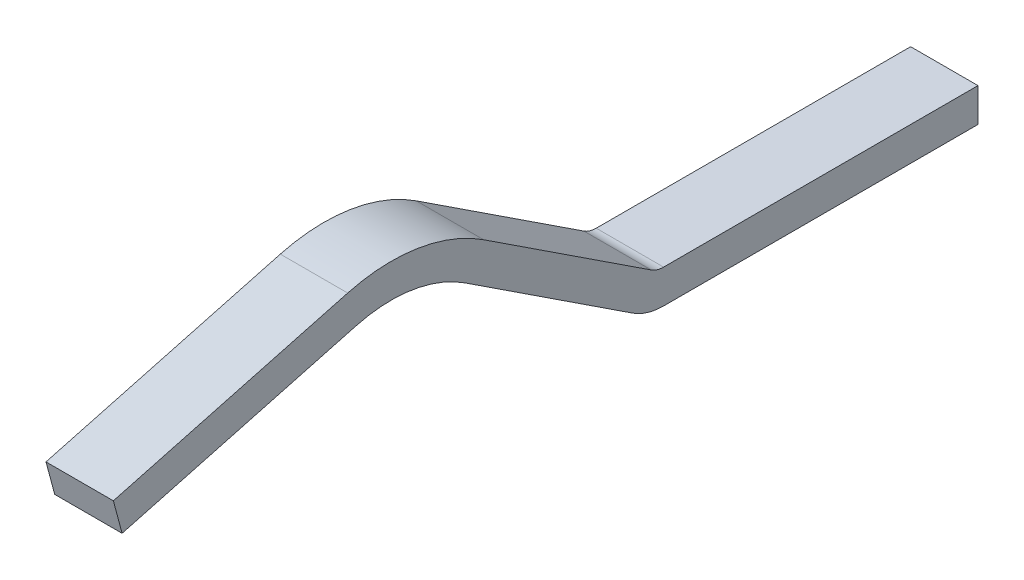
ISO-10303-21;
HEADER;
FILE_DESCRIPTION(('STEP AP214'),'2;1');
FILE_NAME('part.step','',(''),(''),'','','');
FILE_SCHEMA(('AUTOMOTIVE_DESIGN { 1 0 10303 214 1 1 1 1 }'));
ENDSEC;
DATA;
#1=APPLICATION_CONTEXT('core data for automotive mechanical design processes');
#2=APPLICATION_PROTOCOL_DEFINITION('international standard','automotive_design',2000,#1);
#3=PRODUCT_CONTEXT('',#1,'mechanical');
#4=PRODUCT('Part','Part','',(#3));
#5=PRODUCT_RELATED_PRODUCT_CATEGORY('part','',(#4));
#6=PRODUCT_DEFINITION_FORMATION('','',#4);
#7=PRODUCT_DEFINITION_CONTEXT('part definition',#1,'design');
#8=PRODUCT_DEFINITION('design','',#6,#7);
#9=PRODUCT_DEFINITION_SHAPE('','',#8);
#10=(LENGTH_UNIT() NAMED_UNIT(*) SI_UNIT(.MILLI.,.METRE.));
#11=(NAMED_UNIT(*) PLANE_ANGLE_UNIT() SI_UNIT($,.RADIAN.));
#12=(NAMED_UNIT(*) SI_UNIT($,.STERADIAN.) SOLID_ANGLE_UNIT());
#13=UNCERTAINTY_MEASURE_WITH_UNIT(LENGTH_MEASURE(1.E-05),#10,'distance_accuracy_value','');
#14=(GEOMETRIC_REPRESENTATION_CONTEXT(3) GLOBAL_UNCERTAINTY_ASSIGNED_CONTEXT((#13)) GLOBAL_UNIT_ASSIGNED_CONTEXT((#10,
#11,#12)) REPRESENTATION_CONTEXT('',''));
#15=CARTESIAN_POINT('',(0.,0.,0.));
#16=DIRECTION('',(0.,0.,1.));
#17=DIRECTION('',(1.,0.,0.));
#18=AXIS2_PLACEMENT_3D('',#15,#16,#17);
#19=CARTESIAN_POINT('',(-3.45000000000002,5.07100850144757,-0.88999999999999));
#20=DIRECTION('',(-1.,0.,0.));
#21=DIRECTION('',(0.,0.,1.));
#22=AXIS2_PLACEMENT_3D('',#19,#20,#21);
#23=PLANE('',#22);
#24=CARTESIAN_POINT('',(-3.45000000000002,5.07100850144757,-0.88999999999999));
#25=DIRECTION('',(1.,0.,0.));
#26=DIRECTION('',(0.,0.,-1.));
#27=AXIS2_PLACEMENT_3D('',#24,#25,#26);
#28=CIRCLE('',#27,0.0999999999999998);
#29=CARTESIAN_POINT('',(-3.45000000000002,4.98740012933444,-0.835139813046313));
#30=VERTEX_POINT('',#29);
#31=CARTESIAN_POINT('',(-3.45000000000002,4.97100850144757,-0.88999999999999));
#32=VERTEX_POINT('',#31);
#33=EDGE_CURVE('E11',#30,#32,#28,.T.);
#34=ORIENTED_EDGE('',*,*,#33,.T.);
#35=DIRECTION('',(0.,0.,-1.));
#36=VECTOR('',#35,1.);
#37=CARTESIAN_POINT('',(-3.45000000000002,4.97100850144757,-0.88999999999999));
#38=LINE('',#37,#36);
#39=CARTESIAN_POINT('',(-3.45000000000002,4.97100850144757,-2.28999999999999));
#40=VERTEX_POINT('',#39);
#41=EDGE_CURVE('E24',#32,#40,#38,.T.);
#42=ORIENTED_EDGE('',*,*,#41,.T.);
#43=DIRECTION('',(0.,-1.,0.));
#44=VECTOR('',#43,1.);
#45=CARTESIAN_POINT('',(-3.45000000000002,5.07100850144757,-2.28999999999999));
#46=LINE('',#45,#44);
#47=CARTESIAN_POINT('',(-3.45000000000002,4.82100850144757,-2.28999999999999));
#48=VERTEX_POINT('',#47);
#49=EDGE_CURVE('E197',#40,#48,#46,.T.);
#50=ORIENTED_EDGE('',*,*,#49,.T.);
#51=DIRECTION('',(0.,0.,1.));
#52=VECTOR('',#51,1.);
#53=CARTESIAN_POINT('',(-3.45000000000002,4.82100850144757,-0.88999999999999));
#54=LINE('',#53,#52);
#55=CARTESIAN_POINT('',(-3.45000000000002,4.82100850144757,-0.88999999999999));
#56=VERTEX_POINT('',#55);
#57=EDGE_CURVE('E107',#48,#56,#54,.T.);
#58=ORIENTED_EDGE('',*,*,#57,.T.);
#59=CARTESIAN_POINT('',(-3.45000000000002,5.07100850144757,-0.88999999999999));
#60=DIRECTION('',(-1.,0.,0.));
#61=DIRECTION('',(0.,0.,-1.));
#62=AXIS2_PLACEMENT_3D('',#59,#60,#61);
#63=CIRCLE('',#62,0.25);
#64=CARTESIAN_POINT('',(-3.45000000000002,4.86198757116474,-0.752849532615797));
#65=VERTEX_POINT('',#64);
#66=EDGE_CURVE('E194',#56,#65,#63,.T.);
#67=ORIENTED_EDGE('',*,*,#66,.T.);
#68=DIRECTION('',(0.,0.548601869536769,0.836083721131301));
#69=VECTOR('',#68,1.);
#70=CARTESIAN_POINT('',(-3.45000000000002,4.86198757116474,-0.752849532615797));
#71=LINE('',#70,#69);
#72=CARTESIAN_POINT('',(-3.45000000000002,5.35165023267873,-0.00659071931032561));
#73=VERTEX_POINT('',#72);
#74=EDGE_CURVE('E192',#65,#73,#71,.T.);
#75=ORIENTED_EDGE('',*,*,#74,.T.);
#76=CARTESIAN_POINT('',(-3.45000000000002,4.84999999999995,0.322570402411735));
#77=DIRECTION('',(1.,0.,0.));
#78=DIRECTION('',(0.,0.,-1.));
#79=AXIS2_PLACEMENT_3D('',#76,#77,#78);
#80=CIRCLE('',#79,0.6);
#81=CARTESIAN_POINT('',(-3.45000000000002,5.42955549577339,0.477861829473248));
#82=VERTEX_POINT('',#81);
#83=EDGE_CURVE('E190',#73,#82,#80,.T.);
#84=ORIENTED_EDGE('',*,*,#83,.T.);
#85=DIRECTION('',(0.,-0.258819045102522,0.965925826289068));
#86=VECTOR('',#85,1.);
#87=CARTESIAN_POINT('',(-3.45000000000002,5.42955549577339,0.477861829473248));
#88=LINE('',#87,#86);
#89=CARTESIAN_POINT('',(-3.45000000000002,5.15000000000001,1.52117714323463));
#90=VERTEX_POINT('',#89);
#91=EDGE_CURVE('E188',#82,#90,#88,.T.);
#92=ORIENTED_EDGE('',*,*,#91,.T.);
#93=DIRECTION('',(0.,0.965925826289068,0.258819045102521));
#94=VECTOR('',#93,1.);
#95=CARTESIAN_POINT('',(-3.45000000000002,5.15000000000001,1.52117714323463));
#96=LINE('',#95,#94);
#97=CARTESIAN_POINT('',(-3.45000000000002,5.29488887394337,1.56000000000001));
#98=VERTEX_POINT('',#97);
#99=EDGE_CURVE('E186',#90,#98,#96,.T.);
#100=ORIENTED_EDGE('',*,*,#99,.T.);
#101=DIRECTION('',(0.,0.258819045102521,-0.965925826289068));
#102=VECTOR('',#101,1.);
#103=CARTESIAN_POINT('',(-3.45000000000002,5.29488887394337,1.56000000000001));
#104=LINE('',#103,#102);
#105=CARTESIAN_POINT('',(-3.45000000000002,5.57444436971675,0.516684686238627));
#106=VERTEX_POINT('',#105);
#107=EDGE_CURVE('E184',#98,#106,#104,.T.);
#108=ORIENTED_EDGE('',*,*,#107,.T.);
#109=CARTESIAN_POINT('',(-3.45000000000002,4.84999999999995,0.322570402411735));
#110=DIRECTION('',(-1.,0.,0.));
#111=DIRECTION('',(0.,0.,-1.));
#112=AXIS2_PLACEMENT_3D('',#109,#110,#111);
#113=CIRCLE('',#112,0.75);
#114=CARTESIAN_POINT('',(-3.45000000000002,5.47706279084843,-0.08888099974084));
#115=VERTEX_POINT('',#114);
#116=EDGE_CURVE('E182',#106,#115,#113,.T.);
#117=ORIENTED_EDGE('',*,*,#116,.T.);
#118=DIRECTION('',(0.,-0.548601869536769,-0.836083721131301));
#119=VECTOR('',#118,1.);
#120=CARTESIAN_POINT('',(-3.45000000000002,5.47706279084843,-0.08888099974084));
#121=LINE('',#120,#119);
#122=EDGE_CURVE('E180',#115,#30,#121,.T.);
#123=ORIENTED_EDGE('',*,*,#122,.T.);
#124=EDGE_LOOP('',(#34,#42,#50,#58,#67,#75,#84,#92,#100,#108,#117,#123));
#125=FACE_BOUND('',#124,.T.);
#126=ADVANCED_FACE('F17',(#125),#23,.T.);
#127=CARTESIAN_POINT('',(-3.45000000000002,4.97100850144757,-2.28999999999999));
#128=DIRECTION('',(0.,-1.,0.));
#129=DIRECTION('',(0.,0.,-1.));
#130=AXIS2_PLACEMENT_3D('',#127,#128,#129);
#131=PLANE('',#130);
#132=DIRECTION('',(1.,0.,0.));
#133=VECTOR('',#132,1.);
#134=CARTESIAN_POINT('',(-3.45000000000002,4.97100850144757,-2.28999999999999));
#135=LINE('',#134,#133);
#136=CARTESIAN_POINT('',(-3.15000000000002,4.97100850144757,-2.28999999999999));
#137=VERTEX_POINT('',#136);
#138=EDGE_CURVE('E124',#40,#137,#135,.T.);
#139=ORIENTED_EDGE('',*,*,#138,.F.);
#140=ORIENTED_EDGE('',*,*,#41,.F.);
#141=DIRECTION('',(-1.,0.,0.));
#142=VECTOR('',#141,1.);
#143=CARTESIAN_POINT('',(-3.45000000000002,4.97100850144757,-0.88999999999999));
#144=LINE('',#143,#142);
#145=CARTESIAN_POINT('',(-3.15000000000002,4.97100850144757,-0.88999999999999));
#146=VERTEX_POINT('',#145);
#147=EDGE_CURVE('E177',#146,#32,#144,.T.);
#148=ORIENTED_EDGE('',*,*,#147,.F.);
#149=DIRECTION('',(0.,0.,1.));
#150=VECTOR('',#149,1.);
#151=CARTESIAN_POINT('',(-3.15000000000002,4.97100850144757,-2.28999999999999));
#152=LINE('',#151,#150);
#153=EDGE_CURVE('E175',#137,#146,#152,.T.);
#154=ORIENTED_EDGE('',*,*,#153,.F.);
#155=EDGE_LOOP('',(#139,#140,#148,#154));
#156=FACE_BOUND('',#155,.T.);
#157=ADVANCED_FACE('F199',(#156),#131,.F.);
#158=CARTESIAN_POINT('',(-3.45000000000002,4.98740012933444,-0.835139813046313));
#159=DIRECTION('',(0.,-0.8360837211313,0.548601869536769));
#160=DIRECTION('',(0.,-0.548601869536769,-0.8360837211313));
#161=AXIS2_PLACEMENT_3D('',#158,#159,#160);
#162=PLANE('',#161);
#163=DIRECTION('',(1.,0.,0.));
#164=VECTOR('',#163,1.);
#165=CARTESIAN_POINT('',(-3.45000000000002,4.98740012933444,-0.835139813046313));
#166=LINE('',#165,#164);
#167=CARTESIAN_POINT('',(-3.15000000000002,4.98740012933444,-0.835139813046313));
#168=VERTEX_POINT('',#167);
#169=EDGE_CURVE('E173',#30,#168,#166,.T.);
#170=ORIENTED_EDGE('',*,*,#169,.F.);
#171=ORIENTED_EDGE('',*,*,#122,.F.);
#172=DIRECTION('',(-1.,0.,0.));
#173=VECTOR('',#172,1.);
#174=CARTESIAN_POINT('',(-3.45000000000002,5.47706279084843,-0.08888099974084));
#175=LINE('',#174,#173);
#176=CARTESIAN_POINT('',(-3.15000000000002,5.47706279084843,-0.08888099974084));
#177=VERTEX_POINT('',#176);
#178=EDGE_CURVE('E170',#177,#115,#175,.T.);
#179=ORIENTED_EDGE('',*,*,#178,.F.);
#180=DIRECTION('',(0.,0.548601869536769,0.836083721131301));
#181=VECTOR('',#180,1.);
#182=CARTESIAN_POINT('',(-3.15000000000002,4.98740012933444,-0.835139813046313));
#183=LINE('',#182,#181);
#184=EDGE_CURVE('E167',#168,#177,#183,.T.);
#185=ORIENTED_EDGE('',*,*,#184,.F.);
#186=EDGE_LOOP('',(#170,#171,#179,#185));
#187=FACE_BOUND('',#186,.T.);
#188=ADVANCED_FACE('F206',(#187),#162,.F.);
#189=CARTESIAN_POINT('',(-3.45000000000002,4.84999999999995,0.322570402411735));
#190=DIRECTION('',(1.,0.,0.));
#191=DIRECTION('',(0.,0.,-1.));
#192=AXIS2_PLACEMENT_3D('',#189,#190,#191);
#193=CYLINDRICAL_SURFACE('',#192,0.75);
#194=ORIENTED_EDGE('',*,*,#116,.F.);
#195=DIRECTION('',(1.,0.,0.));
#196=VECTOR('',#195,1.);
#197=CARTESIAN_POINT('',(-3.45000000000002,5.57444436971675,0.516684686238627));
#198=LINE('',#197,#196);
#199=CARTESIAN_POINT('',(-3.15000000000002,5.57444436971675,0.516684686238627));
#200=VERTEX_POINT('',#199);
#201=EDGE_CURVE('E165',#106,#200,#198,.T.);
#202=ORIENTED_EDGE('',*,*,#201,.T.);
#203=CARTESIAN_POINT('',(-3.15000000000002,4.84999999999995,0.322570402411735));
#204=DIRECTION('',(-1.,0.,0.));
#205=DIRECTION('',(0.,0.,-1.));
#206=AXIS2_PLACEMENT_3D('',#203,#204,#205);
#207=CIRCLE('',#206,0.75);
#208=EDGE_CURVE('E162',#200,#177,#207,.T.);
#209=ORIENTED_EDGE('',*,*,#208,.T.);
#210=ORIENTED_EDGE('',*,*,#178,.T.);
#211=EDGE_LOOP('',(#194,#202,#209,#210));
#212=FACE_BOUND('',#211,.T.);
#213=ADVANCED_FACE('F211',(#212),#193,.T.);
#214=CARTESIAN_POINT('',(-3.45000000000002,5.57444436971675,0.516684686238627));
#215=DIRECTION('',(0.,-0.965925826289068,-0.258819045102522));
#216=DIRECTION('',(0.,0.258819045102522,-0.965925826289068));
#217=AXIS2_PLACEMENT_3D('',#214,#215,#216);
#218=PLANE('',#217);
#219=ORIENTED_EDGE('',*,*,#201,.F.);
#220=ORIENTED_EDGE('',*,*,#107,.F.);
#221=DIRECTION('',(-1.,0.,0.));
#222=VECTOR('',#221,1.);
#223=CARTESIAN_POINT('',(-3.45000000000002,5.29488887394337,1.56000000000001));
#224=LINE('',#223,#222);
#225=CARTESIAN_POINT('',(-3.15000000000002,5.29488887394337,1.56000000000001));
#226=VERTEX_POINT('',#225);
#227=EDGE_CURVE('E159',#226,#98,#224,.T.);
#228=ORIENTED_EDGE('',*,*,#227,.F.);
#229=DIRECTION('',(0.,-0.258819045102521,0.965925826289068));
#230=VECTOR('',#229,1.);
#231=CARTESIAN_POINT('',(-3.15000000000002,5.57444436971675,0.516684686238627));
#232=LINE('',#231,#230);
#233=EDGE_CURVE('E156',#200,#226,#232,.T.);
#234=ORIENTED_EDGE('',*,*,#233,.F.);
#235=EDGE_LOOP('',(#219,#220,#228,#234));
#236=FACE_BOUND('',#235,.T.);
#237=ADVANCED_FACE('F215',(#236),#218,.F.);
#238=CARTESIAN_POINT('',(-3.45000000000002,5.29488887394337,1.56000000000001));
#239=DIRECTION('',(0.,0.258819045102521,-0.965925826289068));
#240=DIRECTION('',(0.,0.965925826289068,0.258819045102521));
#241=AXIS2_PLACEMENT_3D('',#238,#239,#240);
#242=PLANE('',#241);
#243=ORIENTED_EDGE('',*,*,#227,.T.);
#244=ORIENTED_EDGE('',*,*,#99,.F.);
#245=DIRECTION('',(-1.,0.,0.));
#246=VECTOR('',#245,1.);
#247=CARTESIAN_POINT('',(-3.45000000000002,5.15000000000001,1.52117714323463));
#248=LINE('',#247,#246);
#249=CARTESIAN_POINT('',(-3.15000000000002,5.15000000000001,1.52117714323463));
#250=VERTEX_POINT('',#249);
#251=EDGE_CURVE('E153',#250,#90,#248,.T.);
#252=ORIENTED_EDGE('',*,*,#251,.F.);
#253=DIRECTION('',(0.,-0.965925826289068,-0.258819045102521));
#254=VECTOR('',#253,1.);
#255=CARTESIAN_POINT('',(-3.15000000000002,5.29488887394337,1.56000000000001));
#256=LINE('',#255,#254);
#257=EDGE_CURVE('E150',#226,#250,#256,.T.);
#258=ORIENTED_EDGE('',*,*,#257,.F.);
#259=EDGE_LOOP('',(#243,#244,#252,#258));
#260=FACE_BOUND('',#259,.T.);
#261=ADVANCED_FACE('F219',(#260),#242,.F.);
#262=CARTESIAN_POINT('',(-3.45000000000002,5.15000000000001,1.52117714323463));
#263=DIRECTION('',(0.,0.965925826289068,0.258819045102522));
#264=DIRECTION('',(0.,-0.258819045102522,0.965925826289068));
#265=AXIS2_PLACEMENT_3D('',#262,#263,#264);
#266=PLANE('',#265);
#267=ORIENTED_EDGE('',*,*,#251,.T.);
#268=ORIENTED_EDGE('',*,*,#91,.F.);
#269=DIRECTION('',(-1.,0.,0.));
#270=VECTOR('',#269,1.);
#271=CARTESIAN_POINT('',(-3.45000000000002,5.42955549577339,0.477861829473248));
#272=LINE('',#271,#270);
#273=CARTESIAN_POINT('',(-3.15000000000002,5.42955549577339,0.477861829473248));
#274=VERTEX_POINT('',#273);
#275=EDGE_CURVE('E147',#274,#82,#272,.T.);
#276=ORIENTED_EDGE('',*,*,#275,.F.);
#277=DIRECTION('',(0.,0.258819045102522,-0.965925826289068));
#278=VECTOR('',#277,1.);
#279=CARTESIAN_POINT('',(-3.15000000000002,5.15000000000001,1.52117714323463));
#280=LINE('',#279,#278);
#281=EDGE_CURVE('E144',#250,#274,#280,.T.);
#282=ORIENTED_EDGE('',*,*,#281,.F.);
#283=EDGE_LOOP('',(#267,#268,#276,#282));
#284=FACE_BOUND('',#283,.T.);
#285=ADVANCED_FACE('F223',(#284),#266,.F.);
#286=CARTESIAN_POINT('',(-3.45000000000002,4.84999999999995,0.322570402411735));
#287=DIRECTION('',(1.,0.,0.));
#288=DIRECTION('',(0.,0.,-1.));
#289=AXIS2_PLACEMENT_3D('',#286,#287,#288);
#290=CYLINDRICAL_SURFACE('',#289,0.6);
#291=ORIENTED_EDGE('',*,*,#275,.T.);
#292=ORIENTED_EDGE('',*,*,#83,.F.);
#293=DIRECTION('',(-1.,0.,0.));
#294=VECTOR('',#293,1.);
#295=CARTESIAN_POINT('',(-3.45000000000002,5.35165023267873,-0.00659071931032561));
#296=LINE('',#295,#294);
#297=CARTESIAN_POINT('',(-3.15000000000002,5.35165023267873,-0.00659071931032561));
#298=VERTEX_POINT('',#297);
#299=EDGE_CURVE('E141',#298,#73,#296,.T.);
#300=ORIENTED_EDGE('',*,*,#299,.F.);
#301=CARTESIAN_POINT('',(-3.15000000000002,4.84999999999995,0.322570402411735));
#302=DIRECTION('',(-1.,0.,0.));
#303=DIRECTION('',(0.,0.,-1.));
#304=AXIS2_PLACEMENT_3D('',#301,#302,#303);
#305=CIRCLE('',#304,0.6);
#306=EDGE_CURVE('E139',#274,#298,#305,.T.);
#307=ORIENTED_EDGE('',*,*,#306,.F.);
#308=EDGE_LOOP('',(#291,#292,#300,#307));
#309=FACE_BOUND('',#308,.T.);
#310=ADVANCED_FACE('F227',(#309),#290,.F.);
#311=CARTESIAN_POINT('',(-3.45000000000002,4.86198757116474,-0.752849532615797));
#312=DIRECTION('',(0.,0.8360837211313,-0.548601869536769));
#313=DIRECTION('',(0.,0.548601869536769,0.8360837211313));
#314=AXIS2_PLACEMENT_3D('',#311,#312,#313);
#315=PLANE('',#314);
#316=ORIENTED_EDGE('',*,*,#299,.T.);
#317=ORIENTED_EDGE('',*,*,#74,.F.);
#318=DIRECTION('',(-1.,0.,0.));
#319=VECTOR('',#318,1.);
#320=CARTESIAN_POINT('',(-3.45000000000002,4.86198757116474,-0.752849532615797));
#321=LINE('',#320,#319);
#322=CARTESIAN_POINT('',(-3.15000000000002,4.86198757116474,-0.752849532615797));
#323=VERTEX_POINT('',#322);
#324=EDGE_CURVE('E136',#323,#65,#321,.T.);
#325=ORIENTED_EDGE('',*,*,#324,.F.);
#326=DIRECTION('',(0.,-0.548601869536769,-0.836083721131301));
#327=VECTOR('',#326,1.);
#328=CARTESIAN_POINT('',(-3.15000000000002,4.86198757116474,-0.752849532615797));
#329=LINE('',#328,#327);
#330=EDGE_CURVE('E134',#298,#323,#329,.T.);
#331=ORIENTED_EDGE('',*,*,#330,.F.);
#332=EDGE_LOOP('',(#316,#317,#325,#331));
#333=FACE_BOUND('',#332,.T.);
#334=ADVANCED_FACE('F232',(#333),#315,.F.);
#335=CARTESIAN_POINT('',(-3.45000000000002,5.07100850144757,-0.88999999999999));
#336=DIRECTION('',(1.,0.,0.));
#337=DIRECTION('',(0.,0.,-1.));
#338=AXIS2_PLACEMENT_3D('',#335,#336,#337);
#339=CYLINDRICAL_SURFACE('',#338,0.25);
#340=ORIENTED_EDGE('',*,*,#66,.F.);
#341=DIRECTION('',(1.,0.,0.));
#342=VECTOR('',#341,1.);
#343=CARTESIAN_POINT('',(-3.45000000000002,4.82100850144757,-0.88999999999999));
#344=LINE('',#343,#342);
#345=CARTESIAN_POINT('',(-3.15000000000002,4.82100850144757,-0.88999999999999));
#346=VERTEX_POINT('',#345);
#347=EDGE_CURVE('E132',#56,#346,#344,.T.);
#348=ORIENTED_EDGE('',*,*,#347,.T.);
#349=CARTESIAN_POINT('',(-3.15000000000002,5.07100850144757,-0.88999999999999));
#350=DIRECTION('',(-1.,0.,0.));
#351=DIRECTION('',(0.,0.,-1.));
#352=AXIS2_PLACEMENT_3D('',#349,#350,#351);
#353=CIRCLE('',#352,0.25);
#354=EDGE_CURVE('E111',#346,#323,#353,.T.);
#355=ORIENTED_EDGE('',*,*,#354,.T.);
#356=ORIENTED_EDGE('',*,*,#324,.T.);
#357=EDGE_LOOP('',(#340,#348,#355,#356));
#358=FACE_BOUND('',#357,.T.);
#359=ADVANCED_FACE('F235',(#358),#339,.T.);
#360=CARTESIAN_POINT('',(-3.45000000000002,4.82100850144757,-2.28999999999999));
#361=DIRECTION('',(0.,1.,0.));
#362=DIRECTION('',(0.,0.,1.));
#363=AXIS2_PLACEMENT_3D('',#360,#361,#362);
#364=PLANE('',#363);
#365=ORIENTED_EDGE('',*,*,#347,.F.);
#366=ORIENTED_EDGE('',*,*,#57,.F.);
#367=DIRECTION('',(-1.,0.,0.));
#368=VECTOR('',#367,1.);
#369=CARTESIAN_POINT('',(-3.45000000000002,4.82100850144757,-2.28999999999999));
#370=LINE('',#369,#368);
#371=CARTESIAN_POINT('',(-3.15000000000002,4.82100850144757,-2.28999999999999));
#372=VERTEX_POINT('',#371);
#373=EDGE_CURVE('E102',#372,#48,#370,.T.);
#374=ORIENTED_EDGE('',*,*,#373,.F.);
#375=DIRECTION('',(0.,0.,-1.));
#376=VECTOR('',#375,1.);
#377=CARTESIAN_POINT('',(-3.15000000000002,4.82100850144757,-2.28999999999999));
#378=LINE('',#377,#376);
#379=EDGE_CURVE('E106',#346,#372,#378,.T.);
#380=ORIENTED_EDGE('',*,*,#379,.F.);
#381=EDGE_LOOP('',(#365,#366,#374,#380));
#382=FACE_BOUND('',#381,.T.);
#383=ADVANCED_FACE('F105',(#382),#364,.F.);
#384=CARTESIAN_POINT('',(-3.45000000000002,4.97100850144757,-2.28999999999999));
#385=DIRECTION('',(0.,0.,1.));
#386=DIRECTION('',(1.,0.,0.));
#387=AXIS2_PLACEMENT_3D('',#384,#385,#386);
#388=PLANE('',#387);
#389=ORIENTED_EDGE('',*,*,#373,.T.);
#390=ORIENTED_EDGE('',*,*,#49,.F.);
#391=ORIENTED_EDGE('',*,*,#138,.T.);
#392=DIRECTION('',(0.,1.,0.));
#393=VECTOR('',#392,1.);
#394=CARTESIAN_POINT('',(-3.15000000000002,4.97100850144757,-2.28999999999999));
#395=LINE('',#394,#393);
#396=EDGE_CURVE('E118',#372,#137,#395,.T.);
#397=ORIENTED_EDGE('',*,*,#396,.F.);
#398=EDGE_LOOP('',(#389,#390,#391,#397));
#399=FACE_BOUND('',#398,.T.);
#400=ADVANCED_FACE('F122',(#399),#388,.F.);
#401=CARTESIAN_POINT('',(-3.15000000000002,5.07100850144757,-0.88999999999999));
#402=DIRECTION('',(-1.,0.,0.));
#403=DIRECTION('',(0.,0.,1.));
#404=AXIS2_PLACEMENT_3D('',#401,#402,#403);
#405=PLANE('',#404);
#406=ORIENTED_EDGE('',*,*,#153,.T.);
#407=CARTESIAN_POINT('',(-3.15000000000002,5.07100850144757,-0.88999999999999));
#408=DIRECTION('',(1.,0.,0.));
#409=DIRECTION('',(0.,0.,-1.));
#410=AXIS2_PLACEMENT_3D('',#407,#408,#409);
#411=CIRCLE('',#410,0.0999999999999998);
#412=EDGE_CURVE('E126',#168,#146,#411,.T.);
#413=ORIENTED_EDGE('',*,*,#412,.F.);
#414=ORIENTED_EDGE('',*,*,#184,.T.);
#415=ORIENTED_EDGE('',*,*,#208,.F.);
#416=ORIENTED_EDGE('',*,*,#233,.T.);
#417=ORIENTED_EDGE('',*,*,#257,.T.);
#418=ORIENTED_EDGE('',*,*,#281,.T.);
#419=ORIENTED_EDGE('',*,*,#306,.T.);
#420=ORIENTED_EDGE('',*,*,#330,.T.);
#421=ORIENTED_EDGE('',*,*,#354,.F.);
#422=ORIENTED_EDGE('',*,*,#379,.T.);
#423=ORIENTED_EDGE('',*,*,#396,.T.);
#424=EDGE_LOOP('',(#406,#413,#414,#415,#416,#417,#418,#419,#420,#421,#422,#423));
#425=FACE_BOUND('',#424,.T.);
#426=ADVANCED_FACE('F117',(#425),#405,.F.);
#427=CARTESIAN_POINT('',(-3.45000000000002,5.07100850144757,-0.88999999999999));
#428=DIRECTION('',(1.,0.,0.));
#429=DIRECTION('',(0.,0.,-1.));
#430=AXIS2_PLACEMENT_3D('',#427,#428,#429);
#431=CYLINDRICAL_SURFACE('',#430,0.0999999999999998);
#432=ORIENTED_EDGE('',*,*,#147,.T.);
#433=ORIENTED_EDGE('',*,*,#33,.F.);
#434=ORIENTED_EDGE('',*,*,#169,.T.);
#435=ORIENTED_EDGE('',*,*,#412,.T.);
#436=EDGE_LOOP('',(#432,#433,#434,#435));
#437=FACE_BOUND('',#436,.T.);
#438=ADVANCED_FACE('F201',(#437),#431,.F.);
#439=CLOSED_SHELL('',(#126,#157,#188,#213,#237,#261,#285,#310,#334,#359,#383,#400,#426,#438));
#440=MANIFOLD_SOLID_BREP('B1',#439);
#441=ADVANCED_BREP_SHAPE_REPRESENTATION('',(#18,#440),#14);
#442=SHAPE_DEFINITION_REPRESENTATION(#9,#441);
ENDSEC;
END-ISO-10303-21;
